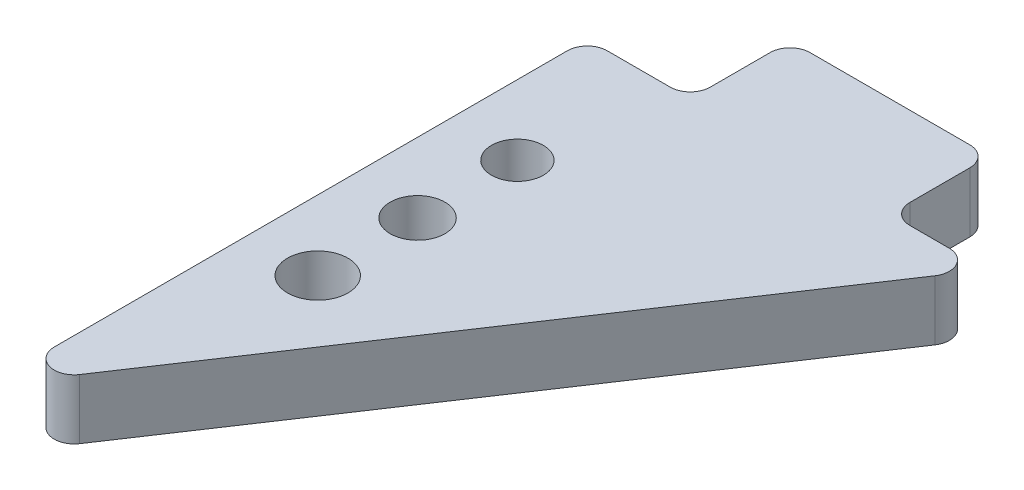
ISO-10303-21;
HEADER;
FILE_DESCRIPTION(('STEP AP214'),'2;1');
FILE_NAME('part.step','',(''),(''),'','','');
FILE_SCHEMA(('AUTOMOTIVE_DESIGN { 1 0 10303 214 1 1 1 1 }'));
ENDSEC;
DATA;
#1=APPLICATION_CONTEXT('core data for automotive mechanical design processes');
#2=APPLICATION_PROTOCOL_DEFINITION('international standard','automotive_design',2000,#1);
#3=PRODUCT_CONTEXT('',#1,'mechanical');
#4=PRODUCT('Part','Part','',(#3));
#5=PRODUCT_RELATED_PRODUCT_CATEGORY('part','',(#4));
#6=PRODUCT_DEFINITION_FORMATION('','',#4);
#7=PRODUCT_DEFINITION_CONTEXT('part definition',#1,'design');
#8=PRODUCT_DEFINITION('design','',#6,#7);
#9=PRODUCT_DEFINITION_SHAPE('','',#8);
#10=(LENGTH_UNIT() NAMED_UNIT(*) SI_UNIT(.MILLI.,.METRE.));
#11=(NAMED_UNIT(*) PLANE_ANGLE_UNIT() SI_UNIT($,.RADIAN.));
#12=(NAMED_UNIT(*) SI_UNIT($,.STERADIAN.) SOLID_ANGLE_UNIT());
#13=UNCERTAINTY_MEASURE_WITH_UNIT(LENGTH_MEASURE(1.E-05),#10,'distance_accuracy_value','');
#14=(GEOMETRIC_REPRESENTATION_CONTEXT(3) GLOBAL_UNCERTAINTY_ASSIGNED_CONTEXT((#13)) GLOBAL_UNIT_ASSIGNED_CONTEXT((#10,
#11,#12)) REPRESENTATION_CONTEXT('',''));
#15=CARTESIAN_POINT('',(0.,0.,0.));
#16=DIRECTION('',(0.,0.,1.));
#17=DIRECTION('',(1.,0.,0.));
#18=AXIS2_PLACEMENT_3D('',#15,#16,#17);
#19=CARTESIAN_POINT('',(50.7677842163831,3.,9.00627438112971));
#20=DIRECTION('',(0.,-1.,0.));
#21=DIRECTION('',(0.,0.,-1.));
#22=AXIS2_PLACEMENT_3D('',#19,#20,#21);
#23=PLANE('',#22);
#24=CARTESIAN_POINT('',(50.7677842163831,3.,9.00627438112971));
#25=DIRECTION('',(0.,1.,0.));
#26=DIRECTION('',(0.,0.,-1.));
#27=AXIS2_PLACEMENT_3D('',#24,#25,#26);
#28=CIRCLE('',#27,1.);
#29=CARTESIAN_POINT('',(50.7677842163831,3.,8.00627438112971));
#30=VERTEX_POINT('',#29);
#31=CARTESIAN_POINT('',(49.7677842163831,3.,9.00627438112971));
#32=VERTEX_POINT('',#31);
#33=EDGE_CURVE('E197',#30,#32,#28,.T.);
#34=ORIENTED_EDGE('',*,*,#33,.T.);
#35=DIRECTION('',(0.,0.,1.));
#36=VECTOR('',#35,1.);
#37=CARTESIAN_POINT('',(49.7677842163831,3.,12.0062743811297));
#38=LINE('',#37,#36);
#39=CARTESIAN_POINT('',(49.7677842163831,3.,12.0062743811297));
#40=VERTEX_POINT('',#39);
#41=EDGE_CURVE('E115',#32,#40,#38,.T.);
#42=ORIENTED_EDGE('',*,*,#41,.T.);
#43=CARTESIAN_POINT('',(48.7677842163831,3.,12.0062743811297));
#44=DIRECTION('',(0.,-1.,0.));
#45=DIRECTION('',(0.,0.,1.));
#46=AXIS2_PLACEMENT_3D('',#43,#44,#45);
#47=CIRCLE('',#46,1.);
#48=CARTESIAN_POINT('',(48.7677842163831,3.,13.0062743811297));
#49=VERTEX_POINT('',#48);
#50=EDGE_CURVE('E230',#40,#49,#47,.T.);
#51=ORIENTED_EDGE('',*,*,#50,.T.);
#52=DIRECTION('',(-1.,0.,0.));
#53=VECTOR('',#52,1.);
#54=CARTESIAN_POINT('',(45.6114318239868,3.,13.0062743811297));
#55=LINE('',#54,#53);
#56=CARTESIAN_POINT('',(45.6114318239868,3.,13.0062743811297));
#57=VERTEX_POINT('',#56);
#58=EDGE_CURVE('E249',#49,#57,#55,.T.);
#59=ORIENTED_EDGE('',*,*,#58,.T.);
#60=CARTESIAN_POINT('',(45.6114318239868,3.,14.0062743811297));
#61=DIRECTION('',(0.,1.,0.));
#62=DIRECTION('',(0.,0.,1.));
#63=AXIS2_PLACEMENT_3D('',#60,#61,#62);
#64=CIRCLE('',#63,1.);
#65=CARTESIAN_POINT('',(44.6114318239868,3.,14.0062743811297));
#66=VERTEX_POINT('',#65);
#67=EDGE_CURVE('E246',#57,#66,#64,.T.);
#68=ORIENTED_EDGE('',*,*,#67,.T.);
#69=DIRECTION('',(0.,0.,1.));
#70=VECTOR('',#69,1.);
#71=CARTESIAN_POINT('',(44.6114318239868,3.,14.0062743811297));
#72=LINE('',#71,#70);
#73=CARTESIAN_POINT('',(44.6114318239868,3.,39.7034987433977));
#74=VERTEX_POINT('',#73);
#75=EDGE_CURVE('E248',#66,#74,#72,.T.);
#76=ORIENTED_EDGE('',*,*,#75,.T.);
#77=CARTESIAN_POINT('',(45.6114318239868,3.,39.7034987433977));
#78=DIRECTION('',(0.,1.,0.));
#79=DIRECTION('',(0.,0.,1.));
#80=AXIS2_PLACEMENT_3D('',#77,#78,#79);
#81=CIRCLE('',#80,1.);
#82=CARTESIAN_POINT('',(46.4434821183246,3.,40.258198939623));
#83=VERTEX_POINT('',#82);
#84=EDGE_CURVE('E251',#74,#83,#81,.T.);
#85=ORIENTED_EDGE('',*,*,#84,.T.);
#86=DIRECTION('',(0.554700196225229,0.,-0.832050294337844));
#87=VECTOR('',#86,1.);
#88=CARTESIAN_POINT('',(46.4434821183246,3.,40.258198939623));
#89=LINE('',#88,#87);
#90=CARTESIAN_POINT('',(63.5749650265033,3.,14.5609745773549));
#91=VERTEX_POINT('',#90);
#92=EDGE_CURVE('E257',#83,#91,#89,.T.);
#93=ORIENTED_EDGE('',*,*,#92,.T.);
#94=CARTESIAN_POINT('',(62.7429147321654,3.,14.0062743811297));
#95=DIRECTION('',(0.,1.,0.));
#96=DIRECTION('',(0.,0.,-1.));
#97=AXIS2_PLACEMENT_3D('',#94,#95,#96);
#98=CIRCLE('',#97,1.);
#99=CARTESIAN_POINT('',(62.7429147321654,3.,13.0062743811297));
#100=VERTEX_POINT('',#99);
#101=EDGE_CURVE('E259',#91,#100,#98,.T.);
#102=ORIENTED_EDGE('',*,*,#101,.T.);
#103=DIRECTION('',(-1.,0.,0.));
#104=VECTOR('',#103,1.);
#105=CARTESIAN_POINT('',(60.7677842163831,3.,13.0062743811297));
#106=LINE('',#105,#104);
#107=CARTESIAN_POINT('',(60.7677842163831,3.,13.0062743811297));
#108=VERTEX_POINT('',#107);
#109=EDGE_CURVE('E261',#100,#108,#106,.T.);
#110=ORIENTED_EDGE('',*,*,#109,.T.);
#111=CARTESIAN_POINT('',(60.7677842163831,3.,12.0062743811297));
#112=DIRECTION('',(0.,-1.,0.));
#113=DIRECTION('',(0.,0.,-1.));
#114=AXIS2_PLACEMENT_3D('',#111,#112,#113);
#115=CIRCLE('',#114,1.);
#116=CARTESIAN_POINT('',(59.7677842163831,3.,12.0062743811297));
#117=VERTEX_POINT('',#116);
#118=EDGE_CURVE('E152',#108,#117,#115,.T.);
#119=ORIENTED_EDGE('',*,*,#118,.T.);
#120=DIRECTION('',(0.,0.,-1.));
#121=VECTOR('',#120,1.);
#122=CARTESIAN_POINT('',(59.7677842163831,3.,12.0062743811297));
#123=LINE('',#122,#121);
#124=CARTESIAN_POINT('',(59.7677842163831,3.,9.00627438112971));
#125=VERTEX_POINT('',#124);
#126=EDGE_CURVE('E146',#117,#125,#123,.T.);
#127=ORIENTED_EDGE('',*,*,#126,.T.);
#128=CARTESIAN_POINT('',(58.7677842163831,3.,9.00627438112971));
#129=DIRECTION('',(0.,1.,0.));
#130=DIRECTION('',(0.,0.,-1.));
#131=AXIS2_PLACEMENT_3D('',#128,#129,#130);
#132=CIRCLE('',#131,1.);
#133=CARTESIAN_POINT('',(58.7677842163831,3.,8.00627438112971));
#134=VERTEX_POINT('',#133);
#135=EDGE_CURVE('E150',#125,#134,#132,.T.);
#136=ORIENTED_EDGE('',*,*,#135,.T.);
#137=DIRECTION('',(-1.,0.,0.));
#138=VECTOR('',#137,1.);
#139=CARTESIAN_POINT('',(50.7677842163831,3.,8.00627438112971));
#140=LINE('',#139,#138);
#141=EDGE_CURVE('E54',#134,#30,#140,.T.);
#142=ORIENTED_EDGE('',*,*,#141,.T.);
#143=EDGE_LOOP('',(#34,#42,#51,#59,#68,#76,#85,#93,#102,#110,#119,#127,#136,#142));
#144=FACE_BOUND('',#143,.T.);
#145=CARTESIAN_POINT('',(48.1114318239868,3.,30.0062743811297));
#146=DIRECTION('',(0.,1.,0.));
#147=DIRECTION('',(0.,0.,1.));
#148=AXIS2_PLACEMENT_3D('',#145,#146,#147);
#149=CIRCLE('',#148,1.51348174894076);
#150=CARTESIAN_POINT('',(48.1114318239868,3.,31.5197561300705));
#151=VERTEX_POINT('',#150);
#152=EDGE_CURVE('E174',#151,#151,#149,.T.);
#153=ORIENTED_EDGE('',*,*,#152,.F.);
#154=EDGE_LOOP('',(#153));
#155=FACE_BOUND('',#154,.T.);
#156=CARTESIAN_POINT('',(48.1114318239868,3.,25.0062743811297));
#157=DIRECTION('',(0.,1.,0.));
#158=DIRECTION('',(0.,0.,1.));
#159=AXIS2_PLACEMENT_3D('',#156,#157,#158);
#160=CIRCLE('',#159,1.37149164358066);
#161=CARTESIAN_POINT('',(48.1114318239868,3.,26.3777660247104));
#162=VERTEX_POINT('',#161);
#163=EDGE_CURVE('E315',#162,#162,#160,.T.);
#164=ORIENTED_EDGE('',*,*,#163,.F.);
#165=EDGE_LOOP('',(#164));
#166=FACE_BOUND('',#165,.T.);
#167=CARTESIAN_POINT('',(48.1114318239868,3.,20.0062743811297));
#168=DIRECTION('',(0.,1.,0.));
#169=DIRECTION('',(0.,0.,1.));
#170=AXIS2_PLACEMENT_3D('',#167,#168,#169);
#171=CIRCLE('',#170,1.2995039127625);
#172=CARTESIAN_POINT('',(48.1114318239868,3.,21.3057782938922));
#173=VERTEX_POINT('',#172);
#174=EDGE_CURVE('E306',#173,#173,#171,.T.);
#175=ORIENTED_EDGE('',*,*,#174,.F.);
#176=EDGE_LOOP('',(#175));
#177=FACE_BOUND('',#176,.T.);
#178=ADVANCED_FACE('F37',(#144,#155,#166,#177),#23,.F.);
#179=CARTESIAN_POINT('',(50.7677842163831,0.,9.00627438112971));
#180=DIRECTION('',(0.,-1.,0.));
#181=DIRECTION('',(0.,0.,-1.));
#182=AXIS2_PLACEMENT_3D('',#179,#180,#181);
#183=PLANE('',#182);
#184=CARTESIAN_POINT('',(48.1114318239868,0.,25.0062743811297));
#185=DIRECTION('',(0.,1.,0.));
#186=DIRECTION('',(0.,0.,1.));
#187=AXIS2_PLACEMENT_3D('',#184,#185,#186);
#188=CIRCLE('',#187,1.37149164358066);
#189=CARTESIAN_POINT('',(48.1114318239868,0.,26.3777660247104));
#190=VERTEX_POINT('',#189);
#191=EDGE_CURVE('E312',#190,#190,#188,.T.);
#192=ORIENTED_EDGE('',*,*,#191,.T.);
#193=EDGE_LOOP('',(#192));
#194=FACE_BOUND('',#193,.T.);
#195=CARTESIAN_POINT('',(50.7677842163831,0.,9.00627438112971));
#196=DIRECTION('',(0.,1.,0.));
#197=DIRECTION('',(0.,0.,-1.));
#198=AXIS2_PLACEMENT_3D('',#195,#196,#197);
#199=CIRCLE('',#198,1.);
#200=CARTESIAN_POINT('',(50.7677842163831,0.,8.00627438112971));
#201=VERTEX_POINT('',#200);
#202=CARTESIAN_POINT('',(49.7677842163831,0.,9.00627438112971));
#203=VERTEX_POINT('',#202);
#204=EDGE_CURVE('E170',#201,#203,#199,.T.);
#205=ORIENTED_EDGE('',*,*,#204,.F.);
#206=DIRECTION('',(-1.,0.,0.));
#207=VECTOR('',#206,1.);
#208=CARTESIAN_POINT('',(50.7677842163831,0.,8.00627438112971));
#209=LINE('',#208,#207);
#210=CARTESIAN_POINT('',(58.7677842163831,0.,8.00627438112971));
#211=VERTEX_POINT('',#210);
#212=EDGE_CURVE('E107',#211,#201,#209,.T.);
#213=ORIENTED_EDGE('',*,*,#212,.F.);
#214=CARTESIAN_POINT('',(58.7677842163831,0.,9.00627438112971));
#215=DIRECTION('',(0.,1.,0.));
#216=DIRECTION('',(0.,0.,-1.));
#217=AXIS2_PLACEMENT_3D('',#214,#215,#216);
#218=CIRCLE('',#217,1.);
#219=CARTESIAN_POINT('',(59.7677842163831,0.,9.00627438112971));
#220=VERTEX_POINT('',#219);
#221=EDGE_CURVE('E101',#220,#211,#218,.T.);
#222=ORIENTED_EDGE('',*,*,#221,.F.);
#223=DIRECTION('',(0.,0.,-1.));
#224=VECTOR('',#223,1.);
#225=CARTESIAN_POINT('',(59.7677842163831,0.,12.0062743811297));
#226=LINE('',#225,#224);
#227=CARTESIAN_POINT('',(59.7677842163831,0.,12.0062743811297));
#228=VERTEX_POINT('',#227);
#229=EDGE_CURVE('E160',#228,#220,#226,.T.);
#230=ORIENTED_EDGE('',*,*,#229,.F.);
#231=CARTESIAN_POINT('',(60.7677842163831,0.,12.0062743811297));
#232=DIRECTION('',(0.,-1.,0.));
#233=DIRECTION('',(0.,0.,-1.));
#234=AXIS2_PLACEMENT_3D('',#231,#232,#233);
#235=CIRCLE('',#234,1.);
#236=CARTESIAN_POINT('',(60.7677842163831,0.,13.0062743811297));
#237=VERTEX_POINT('',#236);
#238=EDGE_CURVE('E192',#237,#228,#235,.T.);
#239=ORIENTED_EDGE('',*,*,#238,.F.);
#240=DIRECTION('',(-1.,0.,0.));
#241=VECTOR('',#240,1.);
#242=CARTESIAN_POINT('',(60.7677842163831,0.,13.0062743811297));
#243=LINE('',#242,#241);
#244=CARTESIAN_POINT('',(62.7429147321654,0.,13.0062743811297));
#245=VERTEX_POINT('',#244);
#246=EDGE_CURVE('E190',#245,#237,#243,.T.);
#247=ORIENTED_EDGE('',*,*,#246,.F.);
#248=CARTESIAN_POINT('',(62.7429147321654,0.,14.0062743811297));
#249=DIRECTION('',(0.,1.,0.));
#250=DIRECTION('',(0.,0.,-1.));
#251=AXIS2_PLACEMENT_3D('',#248,#249,#250);
#252=CIRCLE('',#251,1.);
#253=CARTESIAN_POINT('',(63.5749650265033,0.,14.5609745773549));
#254=VERTEX_POINT('',#253);
#255=EDGE_CURVE('E188',#254,#245,#252,.T.);
#256=ORIENTED_EDGE('',*,*,#255,.F.);
#257=DIRECTION('',(0.554700196225229,0.,-0.832050294337844));
#258=VECTOR('',#257,1.);
#259=CARTESIAN_POINT('',(46.4434821183246,0.,40.258198939623));
#260=LINE('',#259,#258);
#261=CARTESIAN_POINT('',(46.4434821183246,0.,40.258198939623));
#262=VERTEX_POINT('',#261);
#263=EDGE_CURVE('E186',#262,#254,#260,.T.);
#264=ORIENTED_EDGE('',*,*,#263,.F.);
#265=CARTESIAN_POINT('',(45.6114318239868,0.,39.7034987433977));
#266=DIRECTION('',(0.,1.,0.));
#267=DIRECTION('',(0.,0.,1.));
#268=AXIS2_PLACEMENT_3D('',#265,#266,#267);
#269=CIRCLE('',#268,1.);
#270=CARTESIAN_POINT('',(44.6114318239868,0.,39.7034987433977));
#271=VERTEX_POINT('',#270);
#272=EDGE_CURVE('E184',#271,#262,#269,.T.);
#273=ORIENTED_EDGE('',*,*,#272,.F.);
#274=DIRECTION('',(0.,0.,1.));
#275=VECTOR('',#274,1.);
#276=CARTESIAN_POINT('',(44.6114318239868,0.,14.0062743811297));
#277=LINE('',#276,#275);
#278=CARTESIAN_POINT('',(44.6114318239868,0.,14.0062743811297));
#279=VERTEX_POINT('',#278);
#280=EDGE_CURVE('E182',#279,#271,#277,.T.);
#281=ORIENTED_EDGE('',*,*,#280,.F.);
#282=CARTESIAN_POINT('',(45.6114318239868,0.,14.0062743811297));
#283=DIRECTION('',(0.,1.,0.));
#284=DIRECTION('',(0.,0.,1.));
#285=AXIS2_PLACEMENT_3D('',#282,#283,#284);
#286=CIRCLE('',#285,1.);
#287=CARTESIAN_POINT('',(45.6114318239868,0.,13.0062743811297));
#288=VERTEX_POINT('',#287);
#289=EDGE_CURVE('E180',#288,#279,#286,.T.);
#290=ORIENTED_EDGE('',*,*,#289,.F.);
#291=DIRECTION('',(-1.,0.,0.));
#292=VECTOR('',#291,1.);
#293=CARTESIAN_POINT('',(45.6114318239868,0.,13.0062743811297));
#294=LINE('',#293,#292);
#295=CARTESIAN_POINT('',(48.7677842163831,0.,13.0062743811297));
#296=VERTEX_POINT('',#295);
#297=EDGE_CURVE('E178',#296,#288,#294,.T.);
#298=ORIENTED_EDGE('',*,*,#297,.F.);
#299=CARTESIAN_POINT('',(48.7677842163831,0.,12.0062743811297));
#300=DIRECTION('',(0.,-1.,0.));
#301=DIRECTION('',(0.,0.,1.));
#302=AXIS2_PLACEMENT_3D('',#299,#300,#301);
#303=CIRCLE('',#302,1.);
#304=CARTESIAN_POINT('',(49.7677842163831,0.,12.0062743811297));
#305=VERTEX_POINT('',#304);
#306=EDGE_CURVE('E176',#305,#296,#303,.T.);
#307=ORIENTED_EDGE('',*,*,#306,.F.);
#308=DIRECTION('',(0.,0.,1.));
#309=VECTOR('',#308,1.);
#310=CARTESIAN_POINT('',(49.7677842163831,0.,12.0062743811297));
#311=LINE('',#310,#309);
#312=EDGE_CURVE('E173',#203,#305,#311,.T.);
#313=ORIENTED_EDGE('',*,*,#312,.F.);
#314=EDGE_LOOP('',(#205,#213,#222,#230,#239,#247,#256,#264,#273,#281,#290,#298,#307,#313));
#315=FACE_BOUND('',#314,.T.);
#316=CARTESIAN_POINT('',(48.1114318239868,0.,30.0062743811297));
#317=DIRECTION('',(0.,1.,0.));
#318=DIRECTION('',(0.,0.,1.));
#319=AXIS2_PLACEMENT_3D('',#316,#317,#318);
#320=CIRCLE('',#319,1.51348174894076);
#321=CARTESIAN_POINT('',(48.1114318239868,0.,31.5197561300705));
#322=VERTEX_POINT('',#321);
#323=EDGE_CURVE('E318',#322,#322,#320,.T.);
#324=ORIENTED_EDGE('',*,*,#323,.T.);
#325=EDGE_LOOP('',(#324));
#326=FACE_BOUND('',#325,.T.);
#327=CARTESIAN_POINT('',(48.1114318239868,0.,20.0062743811297));
#328=DIRECTION('',(0.,1.,0.));
#329=DIRECTION('',(0.,0.,1.));
#330=AXIS2_PLACEMENT_3D('',#327,#328,#329);
#331=CIRCLE('',#330,1.2995039127625);
#332=CARTESIAN_POINT('',(48.1114318239868,0.,21.3057782938922));
#333=VERTEX_POINT('',#332);
#334=EDGE_CURVE('E309',#333,#333,#331,.T.);
#335=ORIENTED_EDGE('',*,*,#334,.T.);
#336=EDGE_LOOP('',(#335));
#337=FACE_BOUND('',#336,.T.);
#338=ADVANCED_FACE('F234',(#194,#315,#326,#337),#183,.T.);
#339=CARTESIAN_POINT('',(50.7677842163831,3.,9.00627438112971));
#340=DIRECTION('',(0.,-1.,0.));
#341=DIRECTION('',(0.,0.,-1.));
#342=AXIS2_PLACEMENT_3D('',#339,#340,#341);
#343=CYLINDRICAL_SURFACE('',#342,1.);
#344=ORIENTED_EDGE('',*,*,#204,.T.);
#345=DIRECTION('',(0.,-1.,0.));
#346=VECTOR('',#345,1.);
#347=CARTESIAN_POINT('',(49.7677842163831,3.,9.00627438112971));
#348=LINE('',#347,#346);
#349=EDGE_CURVE('E11',#32,#203,#348,.T.);
#350=ORIENTED_EDGE('',*,*,#349,.F.);
#351=ORIENTED_EDGE('',*,*,#33,.F.);
#352=DIRECTION('',(0.,-1.,0.));
#353=VECTOR('',#352,1.);
#354=CARTESIAN_POINT('',(50.7677842163831,3.,8.00627438112971));
#355=LINE('',#354,#353);
#356=EDGE_CURVE('E166',#30,#201,#355,.T.);
#357=ORIENTED_EDGE('',*,*,#356,.T.);
#358=EDGE_LOOP('',(#344,#350,#351,#357));
#359=FACE_BOUND('',#358,.T.);
#360=ADVANCED_FACE('F39',(#359),#343,.T.);
#361=CARTESIAN_POINT('',(49.7677842163831,3.,12.0062743811297));
#362=DIRECTION('',(1.,0.,0.));
#363=DIRECTION('',(0.,0.,-1.));
#364=AXIS2_PLACEMENT_3D('',#361,#362,#363);
#365=PLANE('',#364);
#366=ORIENTED_EDGE('',*,*,#312,.T.);
#367=DIRECTION('',(0.,-1.,0.));
#368=VECTOR('',#367,1.);
#369=CARTESIAN_POINT('',(49.7677842163831,3.,12.0062743811297));
#370=LINE('',#369,#368);
#371=EDGE_CURVE('E46',#40,#305,#370,.T.);
#372=ORIENTED_EDGE('',*,*,#371,.F.);
#373=ORIENTED_EDGE('',*,*,#41,.F.);
#374=ORIENTED_EDGE('',*,*,#349,.T.);
#375=EDGE_LOOP('',(#366,#372,#373,#374));
#376=FACE_BOUND('',#375,.T.);
#377=ADVANCED_FACE('F441',(#376),#365,.F.);
#378=CARTESIAN_POINT('',(48.7677842163831,3.,12.0062743811297));
#379=DIRECTION('',(0.,-1.,0.));
#380=DIRECTION('',(0.,0.,-1.));
#381=AXIS2_PLACEMENT_3D('',#378,#379,#380);
#382=CYLINDRICAL_SURFACE('',#381,1.);
#383=ORIENTED_EDGE('',*,*,#306,.T.);
#384=DIRECTION('',(0.,-1.,0.));
#385=VECTOR('',#384,1.);
#386=CARTESIAN_POINT('',(48.7677842163831,3.,13.0062743811297));
#387=LINE('',#386,#385);
#388=EDGE_CURVE('E222',#49,#296,#387,.T.);
#389=ORIENTED_EDGE('',*,*,#388,.F.);
#390=ORIENTED_EDGE('',*,*,#50,.F.);
#391=ORIENTED_EDGE('',*,*,#371,.T.);
#392=EDGE_LOOP('',(#383,#389,#390,#391));
#393=FACE_BOUND('',#392,.T.);
#394=ADVANCED_FACE('F228',(#393),#382,.F.);
#395=CARTESIAN_POINT('',(45.6114318239868,3.,13.0062743811297));
#396=DIRECTION('',(0.,0.,1.));
#397=DIRECTION('',(1.,0.,0.));
#398=AXIS2_PLACEMENT_3D('',#395,#396,#397);
#399=PLANE('',#398);
#400=ORIENTED_EDGE('',*,*,#297,.T.);
#401=DIRECTION('',(0.,-1.,0.));
#402=VECTOR('',#401,1.);
#403=CARTESIAN_POINT('',(45.6114318239868,3.,13.0062743811297));
#404=LINE('',#403,#402);
#405=EDGE_CURVE('E219',#57,#288,#404,.T.);
#406=ORIENTED_EDGE('',*,*,#405,.F.);
#407=ORIENTED_EDGE('',*,*,#58,.F.);
#408=ORIENTED_EDGE('',*,*,#388,.T.);
#409=EDGE_LOOP('',(#400,#406,#407,#408));
#410=FACE_BOUND('',#409,.T.);
#411=ADVANCED_FACE('F240',(#410),#399,.F.);
#412=CARTESIAN_POINT('',(45.6114318239868,3.,14.0062743811297));
#413=DIRECTION('',(0.,-1.,0.));
#414=DIRECTION('',(0.,0.,-1.));
#415=AXIS2_PLACEMENT_3D('',#412,#413,#414);
#416=CYLINDRICAL_SURFACE('',#415,1.);
#417=ORIENTED_EDGE('',*,*,#289,.T.);
#418=DIRECTION('',(0.,-1.,0.));
#419=VECTOR('',#418,1.);
#420=CARTESIAN_POINT('',(44.6114318239868,3.,14.0062743811297));
#421=LINE('',#420,#419);
#422=EDGE_CURVE('E216',#66,#279,#421,.T.);
#423=ORIENTED_EDGE('',*,*,#422,.F.);
#424=ORIENTED_EDGE('',*,*,#67,.F.);
#425=ORIENTED_EDGE('',*,*,#405,.T.);
#426=EDGE_LOOP('',(#417,#423,#424,#425));
#427=FACE_BOUND('',#426,.T.);
#428=ADVANCED_FACE('F244',(#427),#416,.T.);
#429=CARTESIAN_POINT('',(44.6114318239868,3.,14.0062743811297));
#430=DIRECTION('',(1.,0.,0.));
#431=DIRECTION('',(0.,0.,-1.));
#432=AXIS2_PLACEMENT_3D('',#429,#430,#431);
#433=PLANE('',#432);
#434=ORIENTED_EDGE('',*,*,#280,.T.);
#435=DIRECTION('',(0.,-1.,0.));
#436=VECTOR('',#435,1.);
#437=CARTESIAN_POINT('',(44.6114318239868,3.,39.7034987433977));
#438=LINE('',#437,#436);
#439=EDGE_CURVE('E213',#74,#271,#438,.T.);
#440=ORIENTED_EDGE('',*,*,#439,.F.);
#441=ORIENTED_EDGE('',*,*,#75,.F.);
#442=ORIENTED_EDGE('',*,*,#422,.T.);
#443=EDGE_LOOP('',(#434,#440,#441,#442));
#444=FACE_BOUND('',#443,.T.);
#445=ADVANCED_FACE('F406',(#444),#433,.F.);
#446=CARTESIAN_POINT('',(45.6114318239868,3.,39.7034987433977));
#447=DIRECTION('',(0.,-1.,0.));
#448=DIRECTION('',(0.,0.,-1.));
#449=AXIS2_PLACEMENT_3D('',#446,#447,#448);
#450=CYLINDRICAL_SURFACE('',#449,1.);
#451=ORIENTED_EDGE('',*,*,#272,.T.);
#452=DIRECTION('',(0.,-1.,0.));
#453=VECTOR('',#452,1.);
#454=CARTESIAN_POINT('',(46.4434821183246,3.,40.258198939623));
#455=LINE('',#454,#453);
#456=EDGE_CURVE('E210',#83,#262,#455,.T.);
#457=ORIENTED_EDGE('',*,*,#456,.F.);
#458=ORIENTED_EDGE('',*,*,#84,.F.);
#459=ORIENTED_EDGE('',*,*,#439,.T.);
#460=EDGE_LOOP('',(#451,#457,#458,#459));
#461=FACE_BOUND('',#460,.T.);
#462=ADVANCED_FACE('F396',(#461),#450,.T.);
#463=CARTESIAN_POINT('',(46.4434821183246,3.,40.258198939623));
#464=DIRECTION('',(-0.832050294337844,0.,-0.554700196225229));
#465=DIRECTION('',(-0.554700196225229,0.,0.832050294337844));
#466=AXIS2_PLACEMENT_3D('',#463,#464,#465);
#467=PLANE('',#466);
#468=ORIENTED_EDGE('',*,*,#263,.T.);
#469=DIRECTION('',(0.,-1.,0.));
#470=VECTOR('',#469,1.);
#471=CARTESIAN_POINT('',(63.5749650265033,3.,14.5609745773549));
#472=LINE('',#471,#470);
#473=EDGE_CURVE('E207',#91,#254,#472,.T.);
#474=ORIENTED_EDGE('',*,*,#473,.F.);
#475=ORIENTED_EDGE('',*,*,#92,.F.);
#476=ORIENTED_EDGE('',*,*,#456,.T.);
#477=EDGE_LOOP('',(#468,#474,#475,#476));
#478=FACE_BOUND('',#477,.T.);
#479=ADVANCED_FACE('F386',(#478),#467,.F.);
#480=CARTESIAN_POINT('',(62.7429147321654,3.,14.0062743811297));
#481=DIRECTION('',(0.,-1.,0.));
#482=DIRECTION('',(0.,0.,-1.));
#483=AXIS2_PLACEMENT_3D('',#480,#481,#482);
#484=CYLINDRICAL_SURFACE('',#483,1.);
#485=ORIENTED_EDGE('',*,*,#255,.T.);
#486=DIRECTION('',(0.,-1.,0.));
#487=VECTOR('',#486,1.);
#488=CARTESIAN_POINT('',(62.7429147321654,3.,13.0062743811297));
#489=LINE('',#488,#487);
#490=EDGE_CURVE('E204',#100,#245,#489,.T.);
#491=ORIENTED_EDGE('',*,*,#490,.F.);
#492=ORIENTED_EDGE('',*,*,#101,.F.);
#493=ORIENTED_EDGE('',*,*,#473,.T.);
#494=EDGE_LOOP('',(#485,#491,#492,#493));
#495=FACE_BOUND('',#494,.T.);
#496=ADVANCED_FACE('F377',(#495),#484,.T.);
#497=CARTESIAN_POINT('',(60.7677842163831,3.,13.0062743811297));
#498=DIRECTION('',(0.,0.,1.));
#499=DIRECTION('',(1.,0.,0.));
#500=AXIS2_PLACEMENT_3D('',#497,#498,#499);
#501=PLANE('',#500);
#502=ORIENTED_EDGE('',*,*,#246,.T.);
#503=DIRECTION('',(0.,-1.,0.));
#504=VECTOR('',#503,1.);
#505=CARTESIAN_POINT('',(60.7677842163831,3.,13.0062743811297));
#506=LINE('',#505,#504);
#507=EDGE_CURVE('E201',#108,#237,#506,.T.);
#508=ORIENTED_EDGE('',*,*,#507,.F.);
#509=ORIENTED_EDGE('',*,*,#109,.F.);
#510=ORIENTED_EDGE('',*,*,#490,.T.);
#511=EDGE_LOOP('',(#502,#508,#509,#510));
#512=FACE_BOUND('',#511,.T.);
#513=ADVANCED_FACE('F267',(#512),#501,.F.);
#514=CARTESIAN_POINT('',(60.7677842163831,3.,12.0062743811297));
#515=DIRECTION('',(0.,-1.,0.));
#516=DIRECTION('',(0.,0.,-1.));
#517=AXIS2_PLACEMENT_3D('',#514,#515,#516);
#518=CYLINDRICAL_SURFACE('',#517,1.);
#519=ORIENTED_EDGE('',*,*,#238,.T.);
#520=DIRECTION('',(0.,-1.,0.));
#521=VECTOR('',#520,1.);
#522=CARTESIAN_POINT('',(59.7677842163831,3.,12.0062743811297));
#523=LINE('',#522,#521);
#524=EDGE_CURVE('E161',#117,#228,#523,.T.);
#525=ORIENTED_EDGE('',*,*,#524,.F.);
#526=ORIENTED_EDGE('',*,*,#118,.F.);
#527=ORIENTED_EDGE('',*,*,#507,.T.);
#528=EDGE_LOOP('',(#519,#525,#526,#527));
#529=FACE_BOUND('',#528,.T.);
#530=ADVANCED_FACE('F271',(#529),#518,.F.);
#531=CARTESIAN_POINT('',(59.7677842163831,3.,12.0062743811297));
#532=DIRECTION('',(-1.,0.,0.));
#533=DIRECTION('',(0.,0.,1.));
#534=AXIS2_PLACEMENT_3D('',#531,#532,#533);
#535=PLANE('',#534);
#536=ORIENTED_EDGE('',*,*,#229,.T.);
#537=DIRECTION('',(0.,-1.,0.));
#538=VECTOR('',#537,1.);
#539=CARTESIAN_POINT('',(59.7677842163831,3.,9.00627438112971));
#540=LINE('',#539,#538);
#541=EDGE_CURVE('E157',#125,#220,#540,.T.);
#542=ORIENTED_EDGE('',*,*,#541,.F.);
#543=ORIENTED_EDGE('',*,*,#126,.F.);
#544=ORIENTED_EDGE('',*,*,#524,.T.);
#545=EDGE_LOOP('',(#536,#542,#543,#544));
#546=FACE_BOUND('',#545,.T.);
#547=ADVANCED_FACE('F158',(#546),#535,.F.);
#548=CARTESIAN_POINT('',(58.7677842163831,3.,9.00627438112971));
#549=DIRECTION('',(0.,-1.,0.));
#550=DIRECTION('',(0.,0.,-1.));
#551=AXIS2_PLACEMENT_3D('',#548,#549,#550);
#552=CYLINDRICAL_SURFACE('',#551,1.);
#553=ORIENTED_EDGE('',*,*,#221,.T.);
#554=DIRECTION('',(0.,-1.,0.));
#555=VECTOR('',#554,1.);
#556=CARTESIAN_POINT('',(58.7677842163831,3.,8.00627438112971));
#557=LINE('',#556,#555);
#558=EDGE_CURVE('E162',#134,#211,#557,.T.);
#559=ORIENTED_EDGE('',*,*,#558,.F.);
#560=ORIENTED_EDGE('',*,*,#135,.F.);
#561=ORIENTED_EDGE('',*,*,#541,.T.);
#562=EDGE_LOOP('',(#553,#559,#560,#561));
#563=FACE_BOUND('',#562,.T.);
#564=ADVANCED_FACE('F164',(#563),#552,.T.);
#565=CARTESIAN_POINT('',(50.7677842163831,3.,8.00627438112971));
#566=DIRECTION('',(0.,0.,1.));
#567=DIRECTION('',(1.,0.,0.));
#568=AXIS2_PLACEMENT_3D('',#565,#566,#567);
#569=PLANE('',#568);
#570=ORIENTED_EDGE('',*,*,#212,.T.);
#571=ORIENTED_EDGE('',*,*,#356,.F.);
#572=ORIENTED_EDGE('',*,*,#141,.F.);
#573=ORIENTED_EDGE('',*,*,#558,.T.);
#574=EDGE_LOOP('',(#570,#571,#572,#573));
#575=FACE_BOUND('',#574,.T.);
#576=ADVANCED_FACE('F275',(#575),#569,.F.);
#577=CARTESIAN_POINT('',(48.1114318239868,3.,30.0062743811297));
#578=DIRECTION('',(0.,-1.,0.));
#579=DIRECTION('',(0.,0.,-1.));
#580=AXIS2_PLACEMENT_3D('',#577,#578,#579);
#581=CYLINDRICAL_SURFACE('',#580,1.51348174894076);
#582=ORIENTED_EDGE('',*,*,#152,.T.);
#583=EDGE_LOOP('',(#582));
#584=FACE_BOUND('',#583,.T.);
#585=ORIENTED_EDGE('',*,*,#323,.F.);
#586=EDGE_LOOP('',(#585));
#587=FACE_BOUND('',#586,.T.);
#588=ADVANCED_FACE('F277',(#584,#587),#581,.F.);
#589=CARTESIAN_POINT('',(48.1114318239868,3.,25.0062743811297));
#590=DIRECTION('',(0.,-1.,0.));
#591=DIRECTION('',(0.,0.,-1.));
#592=AXIS2_PLACEMENT_3D('',#589,#590,#591);
#593=CYLINDRICAL_SURFACE('',#592,1.37149164358066);
#594=ORIENTED_EDGE('',*,*,#163,.T.);
#595=EDGE_LOOP('',(#594));
#596=FACE_BOUND('',#595,.T.);
#597=ORIENTED_EDGE('',*,*,#191,.F.);
#598=EDGE_LOOP('',(#597));
#599=FACE_BOUND('',#598,.T.);
#600=ADVANCED_FACE('F283',(#596,#599),#593,.F.);
#601=CARTESIAN_POINT('',(48.1114318239868,3.,20.0062743811297));
#602=DIRECTION('',(0.,-1.,0.));
#603=DIRECTION('',(0.,0.,-1.));
#604=AXIS2_PLACEMENT_3D('',#601,#602,#603);
#605=CYLINDRICAL_SURFACE('',#604,1.2995039127625);
#606=ORIENTED_EDGE('',*,*,#174,.T.);
#607=EDGE_LOOP('',(#606));
#608=FACE_BOUND('',#607,.T.);
#609=ORIENTED_EDGE('',*,*,#334,.F.);
#610=EDGE_LOOP('',(#609));
#611=FACE_BOUND('',#610,.T.);
#612=ADVANCED_FACE('F297',(#608,#611),#605,.F.);
#613=CLOSED_SHELL('',(#178,#338,#360,#377,#394,#411,#428,#445,#462,#479,#496,#513,#530,#547,
#564,#576,#588,#600,#612));
#614=MANIFOLD_SOLID_BREP('B2',#613);
#615=ADVANCED_BREP_SHAPE_REPRESENTATION('',(#18,#614),#14);
#616=SHAPE_DEFINITION_REPRESENTATION(#9,#615);
ENDSEC;
END-ISO-10303-21;
